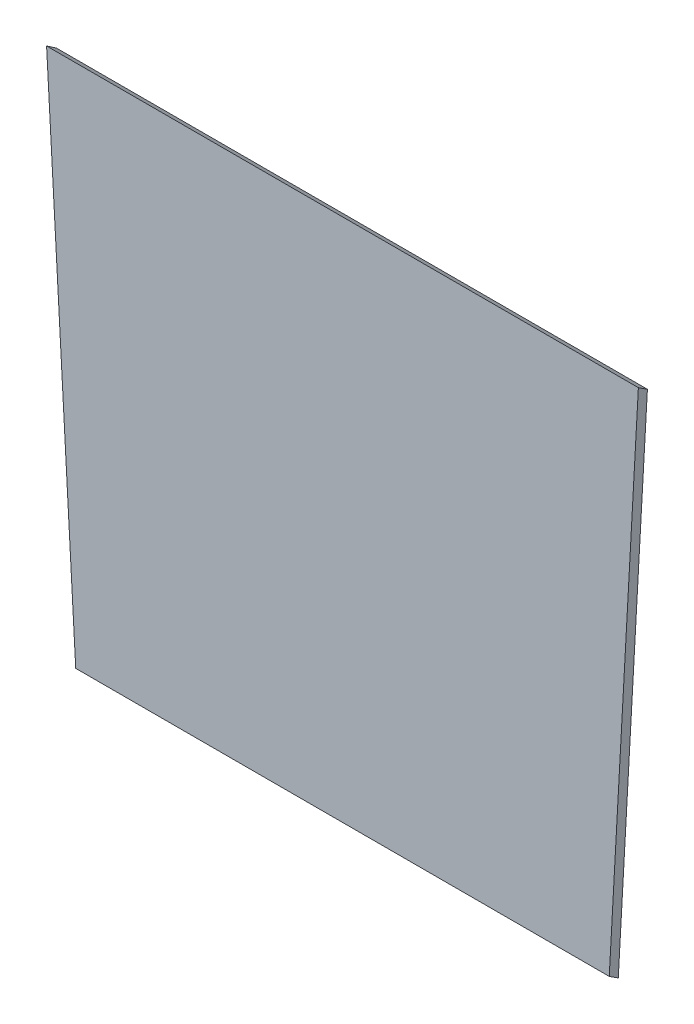
ISO-10303-21;
HEADER;
FILE_DESCRIPTION(('STEP AP214'),'2;1');
FILE_NAME('part.step','',(''),(''),'','','');
FILE_SCHEMA(('AUTOMOTIVE_DESIGN { 1 0 10303 214 1 1 1 1 }'));
ENDSEC;
DATA;
#1=APPLICATION_CONTEXT('core data for automotive mechanical design processes');
#2=APPLICATION_PROTOCOL_DEFINITION('international standard','automotive_design',2000,#1);
#3=PRODUCT_CONTEXT('',#1,'mechanical');
#4=PRODUCT('Part','Part','',(#3));
#5=PRODUCT_RELATED_PRODUCT_CATEGORY('part','',(#4));
#6=PRODUCT_DEFINITION_FORMATION('','',#4);
#7=PRODUCT_DEFINITION_CONTEXT('part definition',#1,'design');
#8=PRODUCT_DEFINITION('design','',#6,#7);
#9=PRODUCT_DEFINITION_SHAPE('','',#8);
#10=(LENGTH_UNIT() NAMED_UNIT(*) SI_UNIT(.MILLI.,.METRE.));
#11=(NAMED_UNIT(*) PLANE_ANGLE_UNIT() SI_UNIT($,.RADIAN.));
#12=(NAMED_UNIT(*) SI_UNIT($,.STERADIAN.) SOLID_ANGLE_UNIT());
#13=UNCERTAINTY_MEASURE_WITH_UNIT(LENGTH_MEASURE(1.E-05),#10,'distance_accuracy_value','');
#14=(GEOMETRIC_REPRESENTATION_CONTEXT(3) GLOBAL_UNCERTAINTY_ASSIGNED_CONTEXT((#13)) GLOBAL_UNIT_ASSIGNED_CONTEXT((#10,
#11,#12)) REPRESENTATION_CONTEXT('',''));
#15=CARTESIAN_POINT('',(0.,0.,0.));
#16=DIRECTION('',(0.,0.,1.));
#17=DIRECTION('',(1.,0.,0.));
#18=AXIS2_PLACEMENT_3D('',#15,#16,#17);
#19=CARTESIAN_POINT('',(-375.653868858216,-724.358990610332,30.));
#20=DIRECTION('',(0.998460575252879,0.0554660226236781,0.));
#21=DIRECTION('',(-0.0554660226236781,0.998460575252879,0.));
#22=AXIS2_PLACEMENT_3D('',#19,#20,#21);
#23=PLANE('',#22);
#24=DIRECTION('',(0.030751425170143,-0.553565664398647,-0.832237589303012));
#25=VECTOR('',#24,1.);
#26=CARTESIAN_POINT('',(-376.421643616753,-710.53804598853,20.7785821514665));
#27=LINE('',#26,#25);
#28=CARTESIAN_POINT('',(-376.762377734722,-704.40438852865,30.));
#29=VERTEX_POINT('',#28);
#30=CARTESIAN_POINT('',(-375.653868858216,-724.358990610332,0.));
#31=VERTEX_POINT('',#30);
#32=EDGE_CURVE('E58',#29,#31,#27,.T.);
#33=ORIENTED_EDGE('',*,*,#32,.F.);
#34=DIRECTION('',(0.0554660226236781,-0.998460575252879,0.));
#35=VECTOR('',#34,1.);
#36=CARTESIAN_POINT('',(-375.653868858216,-724.358990610332,30.));
#37=LINE('',#36,#35);
#38=CARTESIAN_POINT('',(-469.958925703217,973.254734923315,30.));
#39=VERTEX_POINT('',#38);
#40=EDGE_CURVE('E96',#39,#29,#37,.T.);
#41=ORIENTED_EDGE('',*,*,#40,.F.);
#42=DIRECTION('',(-0.030751425170143,0.553565664398647,0.832237589303012));
#43=VECTOR('',#42,1.);
#44=CARTESIAN_POINT('',(-440.971381223303,451.441217971612,-754.501011068623));
#45=LINE('',#44,#43);
#46=CARTESIAN_POINT('',(-468.850416826711,953.300132841634,0.));
#47=VERTEX_POINT('',#46);
#48=EDGE_CURVE('E77',#47,#39,#45,.T.);
#49=ORIENTED_EDGE('',*,*,#48,.F.);
#50=DIRECTION('',(0.0554660226236781,-0.998460575252879,0.));
#51=VECTOR('',#50,1.);
#52=CARTESIAN_POINT('',(-375.653868858216,-724.358990610332,0.));
#53=LINE('',#52,#51);
#54=EDGE_CURVE('E101',#47,#31,#53,.T.);
#55=ORIENTED_EDGE('',*,*,#54,.T.);
#56=EDGE_LOOP('',(#33,#41,#49,#55));
#57=FACE_BOUND('',#56,.T.);
#58=ADVANCED_FACE('F39',(#57),#23,.F.);
#59=CARTESIAN_POINT('',(1423.15243177678,973.254734923315,30.));
#60=DIRECTION('',(-0.998460575252879,0.0554660226236763,0.));
#61=DIRECTION('',(-0.0554660226236763,-0.998460575252879,0.));
#62=AXIS2_PLACEMENT_3D('',#59,#60,#61);
#63=PLANE('',#62);
#64=DIRECTION('',(0.030751425170142,0.553565664398647,0.832237589303012));
#65=VECTOR('',#64,1.);
#66=CARTESIAN_POINT('',(1358.60269417023,-188.724529036826,805.279593220089));
#67=LINE('',#66,#65);
#68=CARTESIAN_POINT('',(1328.84737493178,-724.358990610331,0.));
#69=VERTEX_POINT('',#68);
#70=CARTESIAN_POINT('',(1329.95588380829,-704.40438852865,30.));
#71=VERTEX_POINT('',#70);
#72=EDGE_CURVE('E106',#69,#71,#67,.T.);
#73=ORIENTED_EDGE('',*,*,#72,.F.);
#74=DIRECTION('',(0.0554660226236763,0.998460575252879,0.));
#75=VECTOR('',#74,1.);
#76=CARTESIAN_POINT('',(1423.15243177678,973.254734923315,0.));
#77=LINE('',#76,#75);
#78=CARTESIAN_POINT('',(1422.04392290028,953.300132841634,0.));
#79=VERTEX_POINT('',#78);
#80=EDGE_CURVE('E93',#69,#79,#77,.T.);
#81=ORIENTED_EDGE('',*,*,#80,.T.);
#82=DIRECTION('',(-0.030751425170142,-0.553565664398647,-0.832237589303012));
#83=VECTOR('',#82,1.);
#84=CARTESIAN_POINT('',(1423.15243177678,973.254734923315,30.));
#85=LINE('',#84,#83);
#86=CARTESIAN_POINT('',(1423.15243177678,973.254734923315,30.));
#87=VERTEX_POINT('',#86);
#88=EDGE_CURVE('E52',#87,#79,#85,.T.);
#89=ORIENTED_EDGE('',*,*,#88,.F.);
#90=DIRECTION('',(0.0554660226236763,0.998460575252879,0.));
#91=VECTOR('',#90,1.);
#92=CARTESIAN_POINT('',(1423.15243177678,973.254734923315,30.));
#93=LINE('',#92,#91);
#94=EDGE_CURVE('E83',#71,#87,#93,.T.);
#95=ORIENTED_EDGE('',*,*,#94,.F.);
#96=EDGE_LOOP('',(#73,#81,#89,#95));
#97=FACE_BOUND('',#96,.T.);
#98=ADVANCED_FACE('F90',(#97),#63,.F.);
#99=CARTESIAN_POINT('',(0.,0.,30.));
#100=DIRECTION('',(0.,0.,-1.));
#101=DIRECTION('',(-1.,0.,0.));
#102=AXIS2_PLACEMENT_3D('',#99,#100,#101);
#103=PLANE('',#102);
#104=DIRECTION('',(-1.,0.,0.));
#105=VECTOR('',#104,1.);
#106=CARTESIAN_POINT('',(1493.145,-704.40438852865,30.));
#107=LINE('',#106,#105);
#108=EDGE_CURVE('E95',#71,#29,#107,.T.);
#109=ORIENTED_EDGE('',*,*,#108,.F.);
#110=ORIENTED_EDGE('',*,*,#94,.T.);
#111=DIRECTION('',(-1.,0.,0.));
#112=VECTOR('',#111,1.);
#113=CARTESIAN_POINT('',(-469.958925703218,973.254734923316,30.));
#114=LINE('',#113,#112);
#115=EDGE_CURVE('E46',#87,#39,#114,.T.);
#116=ORIENTED_EDGE('',*,*,#115,.T.);
#117=ORIENTED_EDGE('',*,*,#40,.T.);
#118=EDGE_LOOP('',(#109,#110,#116,#117));
#119=FACE_BOUND('',#118,.T.);
#120=ADVANCED_FACE('F92',(#119),#103,.F.);
#121=CARTESIAN_POINT('',(0.,0.,0.));
#122=DIRECTION('',(0.,0.,-1.));
#123=DIRECTION('',(-1.,0.,0.));
#124=AXIS2_PLACEMENT_3D('',#121,#122,#123);
#125=PLANE('',#124);
#126=ORIENTED_EDGE('',*,*,#54,.F.);
#127=DIRECTION('',(1.,0.,0.));
#128=VECTOR('',#127,1.);
#129=CARTESIAN_POINT('',(0.,953.300132841634,0.));
#130=LINE('',#129,#128);
#131=EDGE_CURVE('E11',#47,#79,#130,.T.);
#132=ORIENTED_EDGE('',*,*,#131,.T.);
#133=ORIENTED_EDGE('',*,*,#80,.F.);
#134=DIRECTION('',(1.,0.,0.));
#135=VECTOR('',#134,1.);
#136=CARTESIAN_POINT('',(1328.84737493178,-724.358990610332,0.));
#137=LINE('',#136,#135);
#138=EDGE_CURVE('E103',#31,#69,#137,.T.);
#139=ORIENTED_EDGE('',*,*,#138,.F.);
#140=EDGE_LOOP('',(#126,#132,#133,#139));
#141=FACE_BOUND('',#140,.T.);
#142=ADVANCED_FACE('F109',(#141),#125,.T.);
#143=CARTESIAN_POINT('',(1493.145,953.300132841634,0.));
#144=DIRECTION('',(0.,0.832631371410691,-0.553827589907501));
#145=DIRECTION('',(0.,0.553827589907501,0.832631371410691));
#146=AXIS2_PLACEMENT_3D('',#143,#144,#145);
#147=PLANE('',#146);
#148=ORIENTED_EDGE('',*,*,#48,.T.);
#149=ORIENTED_EDGE('',*,*,#115,.F.);
#150=ORIENTED_EDGE('',*,*,#88,.T.);
#151=ORIENTED_EDGE('',*,*,#131,.F.);
#152=EDGE_LOOP('',(#148,#149,#150,#151));
#153=FACE_BOUND('',#152,.T.);
#154=ADVANCED_FACE('F76',(#153),#147,.T.);
#155=CARTESIAN_POINT('',(1493.145,-724.358990610331,0.));
#156=DIRECTION('',(0.,-0.832631371410691,0.553827589907501));
#157=DIRECTION('',(0.,-0.553827589907501,-0.832631371410691));
#158=AXIS2_PLACEMENT_3D('',#155,#156,#157);
#159=PLANE('',#158);
#160=ORIENTED_EDGE('',*,*,#32,.T.);
#161=ORIENTED_EDGE('',*,*,#138,.T.);
#162=ORIENTED_EDGE('',*,*,#72,.T.);
#163=ORIENTED_EDGE('',*,*,#108,.T.);
#164=EDGE_LOOP('',(#160,#161,#162,#163));
#165=FACE_BOUND('',#164,.T.);
#166=ADVANCED_FACE('F104',(#165),#159,.T.);
#167=CLOSED_SHELL('',(#58,#98,#120,#142,#154,#166));
#168=MANIFOLD_SOLID_BREP('B2',#167);
#169=ADVANCED_BREP_SHAPE_REPRESENTATION('',(#18,#168),#14);
#170=SHAPE_DEFINITION_REPRESENTATION(#9,#169);
ENDSEC;
END-ISO-10303-21;
